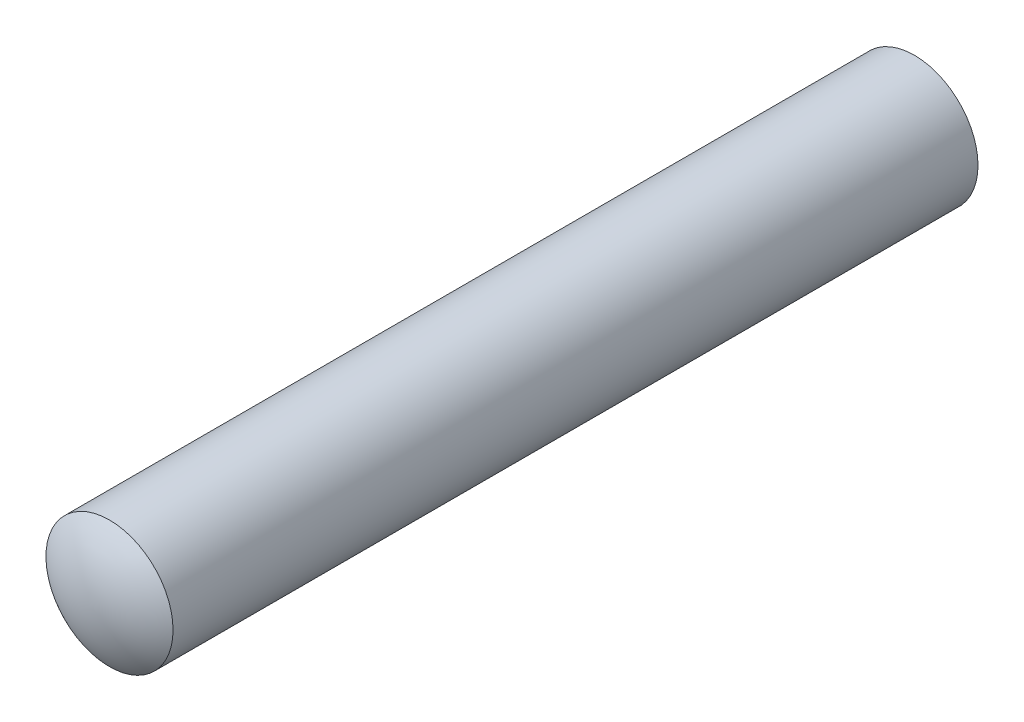
ISO-10303-21;
HEADER;
FILE_DESCRIPTION(('STEP AP214'),'2;1');
FILE_NAME('part.step','',(''),(''),'','','');
FILE_SCHEMA(('AUTOMOTIVE_DESIGN { 1 0 10303 214 1 1 1 1 }'));
ENDSEC;
DATA;
#1=APPLICATION_CONTEXT('core data for automotive mechanical design processes');
#2=APPLICATION_PROTOCOL_DEFINITION('international standard','automotive_design',2000,#1);
#3=PRODUCT_CONTEXT('',#1,'mechanical');
#4=PRODUCT('Part','Part','',(#3));
#5=PRODUCT_RELATED_PRODUCT_CATEGORY('part','',(#4));
#6=PRODUCT_DEFINITION_FORMATION('','',#4);
#7=PRODUCT_DEFINITION_CONTEXT('part definition',#1,'design');
#8=PRODUCT_DEFINITION('design','',#6,#7);
#9=PRODUCT_DEFINITION_SHAPE('','',#8);
#10=(LENGTH_UNIT() NAMED_UNIT(*) SI_UNIT(.MILLI.,.METRE.));
#11=(NAMED_UNIT(*) PLANE_ANGLE_UNIT() SI_UNIT($,.RADIAN.));
#12=(NAMED_UNIT(*) SI_UNIT($,.STERADIAN.) SOLID_ANGLE_UNIT());
#13=UNCERTAINTY_MEASURE_WITH_UNIT(LENGTH_MEASURE(1.E-05),#10,'distance_accuracy_value','');
#14=(GEOMETRIC_REPRESENTATION_CONTEXT(3) GLOBAL_UNCERTAINTY_ASSIGNED_CONTEXT((#13)) GLOBAL_UNIT_ASSIGNED_CONTEXT((#10,
#11,#12)) REPRESENTATION_CONTEXT('',''));
#15=CARTESIAN_POINT('',(0.,0.,0.));
#16=DIRECTION('',(0.,0.,1.));
#17=DIRECTION('',(1.,0.,0.));
#18=AXIS2_PLACEMENT_3D('',#15,#16,#17);
#19=CARTESIAN_POINT('',(0.,0.,7.5));
#20=DIRECTION('',(0.,0.,1.));
#21=DIRECTION('',(0.,1.,0.));
#22=AXIS2_PLACEMENT_3D('',#19,#20,#21);
#23=SPHERICAL_SURFACE('',#22,2.5);
#24=CARTESIAN_POINT('',(0.,0.,9.5));
#25=DIRECTION('',(0.,0.,1.));
#26=DIRECTION('',(1.,0.,0.));
#27=AXIS2_PLACEMENT_3D('',#24,#25,#26);
#28=CIRCLE('',#27,1.5);
#29=CARTESIAN_POINT('',(1.5,0.,9.5));
#30=VERTEX_POINT('',#29);
#31=EDGE_CURVE('E10',#30,#30,#28,.T.);
#32=ORIENTED_EDGE('',*,*,#31,.T.);
#33=EDGE_LOOP('',(#32));
#34=FACE_BOUND('',#33,.T.);
#35=ADVANCED_FACE('F28',(#34),#23,.T.);
#36=CARTESIAN_POINT('',(0.,0.,10.));
#37=DIRECTION('',(0.,0.,1.));
#38=DIRECTION('',(1.,0.,0.));
#39=AXIS2_PLACEMENT_3D('',#36,#37,#38);
#40=CYLINDRICAL_SURFACE('',#39,1.5);
#41=ORIENTED_EDGE('',*,*,#31,.F.);
#42=EDGE_LOOP('',(#41));
#43=FACE_BOUND('',#42,.T.);
#44=CARTESIAN_POINT('',(0.,0.,-9.5));
#45=DIRECTION('',(0.,0.,1.));
#46=DIRECTION('',(1.,0.,0.));
#47=AXIS2_PLACEMENT_3D('',#44,#45,#46);
#48=CIRCLE('',#47,1.5);
#49=CARTESIAN_POINT('',(1.5,0.,-9.5));
#50=VERTEX_POINT('',#49);
#51=EDGE_CURVE('E34',#50,#50,#48,.T.);
#52=ORIENTED_EDGE('',*,*,#51,.T.);
#53=EDGE_LOOP('',(#52));
#54=FACE_BOUND('',#53,.T.);
#55=ADVANCED_FACE('F40',(#43,#54),#40,.T.);
#56=CARTESIAN_POINT('',(0.,0.,-7.50000000000001));
#57=DIRECTION('',(0.,0.,1.));
#58=DIRECTION('',(0.,1.,0.));
#59=AXIS2_PLACEMENT_3D('',#56,#57,#58);
#60=SPHERICAL_SURFACE('',#59,2.49999999999999);
#61=ORIENTED_EDGE('',*,*,#51,.F.);
#62=EDGE_LOOP('',(#61));
#63=FACE_BOUND('',#62,.T.);
#64=ADVANCED_FACE('F42',(#63),#60,.T.);
#65=CLOSED_SHELL('',(#35,#55,#64));
#66=MANIFOLD_SOLID_BREP('B2',#65);
#67=ADVANCED_BREP_SHAPE_REPRESENTATION('',(#18,#66),#14);
#68=SHAPE_DEFINITION_REPRESENTATION(#9,#67);
ENDSEC;
END-ISO-10303-21;
